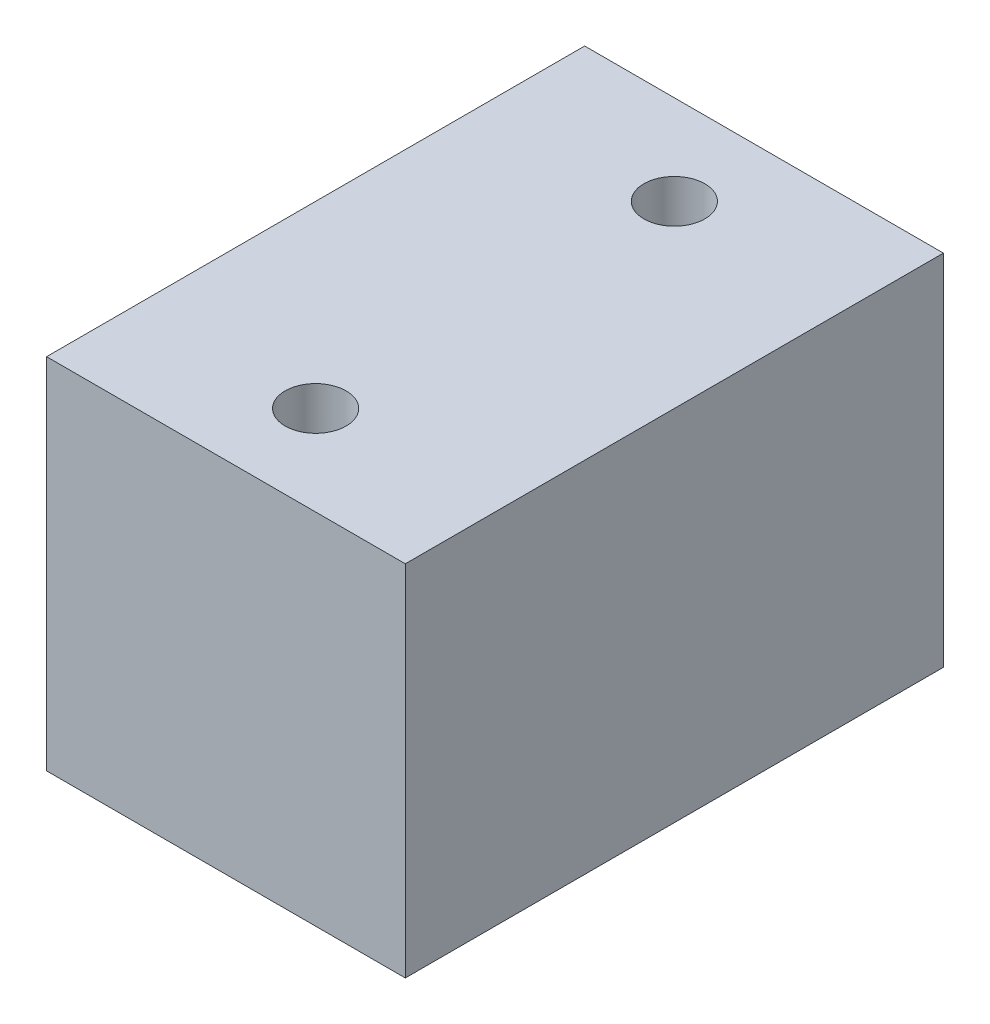
ISO-10303-21;
HEADER;
FILE_DESCRIPTION(('STEP AP214'),'2;1');
FILE_NAME('part.step','',(''),(''),'','','');
FILE_SCHEMA(('AUTOMOTIVE_DESIGN { 1 0 10303 214 1 1 1 1 }'));
ENDSEC;
DATA;
#1=APPLICATION_CONTEXT('core data for automotive mechanical design processes');
#2=APPLICATION_PROTOCOL_DEFINITION('international standard','automotive_design',2000,#1);
#3=PRODUCT_CONTEXT('',#1,'mechanical');
#4=PRODUCT('Part','Part','',(#3));
#5=PRODUCT_RELATED_PRODUCT_CATEGORY('part','',(#4));
#6=PRODUCT_DEFINITION_FORMATION('','',#4);
#7=PRODUCT_DEFINITION_CONTEXT('part definition',#1,'design');
#8=PRODUCT_DEFINITION('design','',#6,#7);
#9=PRODUCT_DEFINITION_SHAPE('','',#8);
#10=(LENGTH_UNIT() NAMED_UNIT(*) SI_UNIT(.MILLI.,.METRE.));
#11=(NAMED_UNIT(*) PLANE_ANGLE_UNIT() SI_UNIT($,.RADIAN.));
#12=(NAMED_UNIT(*) SI_UNIT($,.STERADIAN.) SOLID_ANGLE_UNIT());
#13=UNCERTAINTY_MEASURE_WITH_UNIT(LENGTH_MEASURE(1.E-05),#10,'distance_accuracy_value','');
#14=(GEOMETRIC_REPRESENTATION_CONTEXT(3) GLOBAL_UNCERTAINTY_ASSIGNED_CONTEXT((#13)) GLOBAL_UNIT_ASSIGNED_CONTEXT((#10,
#11,#12)) REPRESENTATION_CONTEXT('',''));
#15=CARTESIAN_POINT('',(0.,0.,0.));
#16=DIRECTION('',(0.,0.,1.));
#17=DIRECTION('',(1.,0.,0.));
#18=AXIS2_PLACEMENT_3D('',#15,#16,#17);
#19=CARTESIAN_POINT('',(10.,10.,30.));
#20=DIRECTION('',(-1.,0.,0.));
#21=DIRECTION('',(0.,-1.,0.));
#22=AXIS2_PLACEMENT_3D('',#19,#20,#21);
#23=PLANE('',#22);
#24=DIRECTION('',(0.,1.,0.));
#25=VECTOR('',#24,1.);
#26=CARTESIAN_POINT('',(10.,10.,0.));
#27=LINE('',#26,#25);
#28=CARTESIAN_POINT('',(10.,-10.,0.));
#29=VERTEX_POINT('',#28);
#30=CARTESIAN_POINT('',(10.,10.,0.));
#31=VERTEX_POINT('',#30);
#32=EDGE_CURVE('E124',#29,#31,#27,.T.);
#33=ORIENTED_EDGE('',*,*,#32,.T.);
#34=DIRECTION('',(0.,0.,-1.));
#35=VECTOR('',#34,1.);
#36=CARTESIAN_POINT('',(10.,10.,30.));
#37=LINE('',#36,#35);
#38=CARTESIAN_POINT('',(10.,10.,30.));
#39=VERTEX_POINT('',#38);
#40=EDGE_CURVE('E11',#39,#31,#37,.T.);
#41=ORIENTED_EDGE('',*,*,#40,.F.);
#42=DIRECTION('',(0.,1.,0.));
#43=VECTOR('',#42,1.);
#44=CARTESIAN_POINT('',(10.,10.,30.));
#45=LINE('',#44,#43);
#46=CARTESIAN_POINT('',(10.,-10.,30.));
#47=VERTEX_POINT('',#46);
#48=EDGE_CURVE('E103',#47,#39,#45,.T.);
#49=ORIENTED_EDGE('',*,*,#48,.F.);
#50=DIRECTION('',(0.,0.,-1.));
#51=VECTOR('',#50,1.);
#52=CARTESIAN_POINT('',(10.,-10.,30.));
#53=LINE('',#52,#51);
#54=EDGE_CURVE('E117',#47,#29,#53,.T.);
#55=ORIENTED_EDGE('',*,*,#54,.T.);
#56=EDGE_LOOP('',(#33,#41,#49,#55));
#57=FACE_BOUND('',#56,.T.);
#58=ADVANCED_FACE('F47',(#57),#23,.F.);
#59=CARTESIAN_POINT('',(-10.,10.,30.));
#60=DIRECTION('',(0.,-1.,0.));
#61=DIRECTION('',(0.,0.,-1.));
#62=AXIS2_PLACEMENT_3D('',#59,#60,#61);
#63=PLANE('',#62);
#64=CARTESIAN_POINT('',(0.,10.,5.));
#65=DIRECTION('',(0.,1.,0.));
#66=DIRECTION('',(0.,0.,1.));
#67=AXIS2_PLACEMENT_3D('',#64,#65,#66);
#68=CIRCLE('',#67,1.7);
#69=CARTESIAN_POINT('',(0.,10.,6.7));
#70=VERTEX_POINT('',#69);
#71=EDGE_CURVE('E140',#70,#70,#68,.T.);
#72=ORIENTED_EDGE('',*,*,#71,.F.);
#73=EDGE_LOOP('',(#72));
#74=FACE_BOUND('',#73,.T.);
#75=CARTESIAN_POINT('',(0.,10.,25.));
#76=DIRECTION('',(0.,1.,0.));
#77=DIRECTION('',(0.,0.,1.));
#78=AXIS2_PLACEMENT_3D('',#75,#76,#77);
#79=CIRCLE('',#78,1.7);
#80=CARTESIAN_POINT('',(0.,10.,26.7));
#81=VERTEX_POINT('',#80);
#82=EDGE_CURVE('E148',#81,#81,#79,.T.);
#83=ORIENTED_EDGE('',*,*,#82,.F.);
#84=EDGE_LOOP('',(#83));
#85=FACE_BOUND('',#84,.T.);
#86=DIRECTION('',(-1.,0.,0.));
#87=VECTOR('',#86,1.);
#88=CARTESIAN_POINT('',(-10.,10.,0.));
#89=LINE('',#88,#87);
#90=CARTESIAN_POINT('',(-10.,10.,0.));
#91=VERTEX_POINT('',#90);
#92=EDGE_CURVE('E107',#31,#91,#89,.T.);
#93=ORIENTED_EDGE('',*,*,#92,.T.);
#94=DIRECTION('',(0.,0.,-1.));
#95=VECTOR('',#94,1.);
#96=CARTESIAN_POINT('',(-10.,10.,30.));
#97=LINE('',#96,#95);
#98=CARTESIAN_POINT('',(-10.,10.,30.));
#99=VERTEX_POINT('',#98);
#100=EDGE_CURVE('E56',#99,#91,#97,.T.);
#101=ORIENTED_EDGE('',*,*,#100,.F.);
#102=DIRECTION('',(-1.,0.,0.));
#103=VECTOR('',#102,1.);
#104=CARTESIAN_POINT('',(-10.,10.,30.));
#105=LINE('',#104,#103);
#106=EDGE_CURVE('E98',#39,#99,#105,.T.);
#107=ORIENTED_EDGE('',*,*,#106,.F.);
#108=ORIENTED_EDGE('',*,*,#40,.T.);
#109=EDGE_LOOP('',(#93,#101,#107,#108));
#110=FACE_BOUND('',#109,.T.);
#111=ADVANCED_FACE('F110',(#74,#85,#110),#63,.F.);
#112=CARTESIAN_POINT('',(-10.,10.,30.));
#113=DIRECTION('',(1.,0.,0.));
#114=DIRECTION('',(0.,1.,0.));
#115=AXIS2_PLACEMENT_3D('',#112,#113,#114);
#116=PLANE('',#115);
#117=DIRECTION('',(0.,-1.,0.));
#118=VECTOR('',#117,1.);
#119=CARTESIAN_POINT('',(-10.,10.,0.));
#120=LINE('',#119,#118);
#121=CARTESIAN_POINT('',(-9.99999999999999,-10.,0.));
#122=VERTEX_POINT('',#121);
#123=EDGE_CURVE('E83',#91,#122,#120,.T.);
#124=ORIENTED_EDGE('',*,*,#123,.T.);
#125=DIRECTION('',(0.,0.,-1.));
#126=VECTOR('',#125,1.);
#127=CARTESIAN_POINT('',(-9.99999999999999,-10.,30.));
#128=LINE('',#127,#126);
#129=CARTESIAN_POINT('',(-9.99999999999999,-10.,30.));
#130=VERTEX_POINT('',#129);
#131=EDGE_CURVE('E109',#130,#122,#128,.T.);
#132=ORIENTED_EDGE('',*,*,#131,.F.);
#133=DIRECTION('',(0.,-1.,0.));
#134=VECTOR('',#133,1.);
#135=CARTESIAN_POINT('',(-10.,10.,30.));
#136=LINE('',#135,#134);
#137=EDGE_CURVE('E101',#99,#130,#136,.T.);
#138=ORIENTED_EDGE('',*,*,#137,.F.);
#139=ORIENTED_EDGE('',*,*,#100,.T.);
#140=EDGE_LOOP('',(#124,#132,#138,#139));
#141=FACE_BOUND('',#140,.T.);
#142=ADVANCED_FACE('F115',(#141),#116,.F.);
#143=CARTESIAN_POINT('',(-9.99999999999999,-10.,30.));
#144=DIRECTION('',(0.,1.,0.));
#145=DIRECTION('',(0.,0.,1.));
#146=AXIS2_PLACEMENT_3D('',#143,#144,#145);
#147=PLANE('',#146);
#148=CARTESIAN_POINT('',(0.,-10.,5.));
#149=DIRECTION('',(0.,1.,0.));
#150=DIRECTION('',(0.,0.,1.));
#151=AXIS2_PLACEMENT_3D('',#148,#149,#150);
#152=CIRCLE('',#151,1.7);
#153=CARTESIAN_POINT('',(0.,-10.,6.7));
#154=VERTEX_POINT('',#153);
#155=EDGE_CURVE('E55',#154,#154,#152,.T.);
#156=ORIENTED_EDGE('',*,*,#155,.T.);
#157=EDGE_LOOP('',(#156));
#158=FACE_BOUND('',#157,.T.);
#159=CARTESIAN_POINT('',(0.,-10.,25.));
#160=DIRECTION('',(0.,1.,0.));
#161=DIRECTION('',(0.,0.,1.));
#162=AXIS2_PLACEMENT_3D('',#159,#160,#161);
#163=CIRCLE('',#162,1.7);
#164=CARTESIAN_POINT('',(0.,-10.,26.7));
#165=VERTEX_POINT('',#164);
#166=EDGE_CURVE('E131',#165,#165,#163,.T.);
#167=ORIENTED_EDGE('',*,*,#166,.T.);
#168=EDGE_LOOP('',(#167));
#169=FACE_BOUND('',#168,.T.);
#170=DIRECTION('',(1.,0.,0.));
#171=VECTOR('',#170,1.);
#172=CARTESIAN_POINT('',(-9.99999999999999,-10.,0.));
#173=LINE('',#172,#171);
#174=EDGE_CURVE('E93',#122,#29,#173,.T.);
#175=ORIENTED_EDGE('',*,*,#174,.T.);
#176=ORIENTED_EDGE('',*,*,#54,.F.);
#177=DIRECTION('',(1.,0.,0.));
#178=VECTOR('',#177,1.);
#179=CARTESIAN_POINT('',(-9.99999999999999,-10.,30.));
#180=LINE('',#179,#178);
#181=EDGE_CURVE('E70',#130,#47,#180,.T.);
#182=ORIENTED_EDGE('',*,*,#181,.F.);
#183=ORIENTED_EDGE('',*,*,#131,.T.);
#184=EDGE_LOOP('',(#175,#176,#182,#183));
#185=FACE_BOUND('',#184,.T.);
#186=ADVANCED_FACE('F179',(#158,#169,#185),#147,.F.);
#187=CARTESIAN_POINT('',(0.,0.,30.));
#188=DIRECTION('',(0.,0.,1.));
#189=DIRECTION('',(1.,0.,0.));
#190=AXIS2_PLACEMENT_3D('',#187,#188,#189);
#191=PLANE('',#190);
#192=ORIENTED_EDGE('',*,*,#48,.T.);
#193=ORIENTED_EDGE('',*,*,#106,.T.);
#194=ORIENTED_EDGE('',*,*,#137,.T.);
#195=ORIENTED_EDGE('',*,*,#181,.T.);
#196=EDGE_LOOP('',(#192,#193,#194,#195));
#197=FACE_BOUND('',#196,.T.);
#198=ADVANCED_FACE('F97',(#197),#191,.T.);
#199=CARTESIAN_POINT('',(0.,0.,0.));
#200=DIRECTION('',(0.,0.,1.));
#201=DIRECTION('',(1.,0.,0.));
#202=AXIS2_PLACEMENT_3D('',#199,#200,#201);
#203=PLANE('',#202);
#204=ORIENTED_EDGE('',*,*,#32,.F.);
#205=ORIENTED_EDGE('',*,*,#174,.F.);
#206=ORIENTED_EDGE('',*,*,#123,.F.);
#207=ORIENTED_EDGE('',*,*,#92,.F.);
#208=EDGE_LOOP('',(#204,#205,#206,#207));
#209=FACE_BOUND('',#208,.T.);
#210=ADVANCED_FACE('F184',(#209),#203,.F.);
#211=CARTESIAN_POINT('',(0.,-20.,25.));
#212=DIRECTION('',(0.,1.,0.));
#213=DIRECTION('',(0.,0.,1.));
#214=AXIS2_PLACEMENT_3D('',#211,#212,#213);
#215=CYLINDRICAL_SURFACE('',#214,1.7);
#216=ORIENTED_EDGE('',*,*,#82,.T.);
#217=EDGE_LOOP('',(#216));
#218=FACE_BOUND('',#217,.T.);
#219=ORIENTED_EDGE('',*,*,#166,.F.);
#220=EDGE_LOOP('',(#219));
#221=FACE_BOUND('',#220,.T.);
#222=ADVANCED_FACE('F166',(#218,#221),#215,.F.);
#223=CARTESIAN_POINT('',(0.,-20.,5.));
#224=DIRECTION('',(0.,1.,0.));
#225=DIRECTION('',(0.,0.,1.));
#226=AXIS2_PLACEMENT_3D('',#223,#224,#225);
#227=CYLINDRICAL_SURFACE('',#226,1.7);
#228=ORIENTED_EDGE('',*,*,#71,.T.);
#229=EDGE_LOOP('',(#228));
#230=FACE_BOUND('',#229,.T.);
#231=ORIENTED_EDGE('',*,*,#155,.F.);
#232=EDGE_LOOP('',(#231));
#233=FACE_BOUND('',#232,.T.);
#234=ADVANCED_FACE('F194',(#230,#233),#227,.F.);
#235=CLOSED_SHELL('',(#58,#111,#142,#186,#198,#210,#222,#234));
#236=MANIFOLD_SOLID_BREP('B2',#235);
#237=ADVANCED_BREP_SHAPE_REPRESENTATION('',(#18,#236),#14);
#238=SHAPE_DEFINITION_REPRESENTATION(#9,#237);
ENDSEC;
END-ISO-10303-21;
